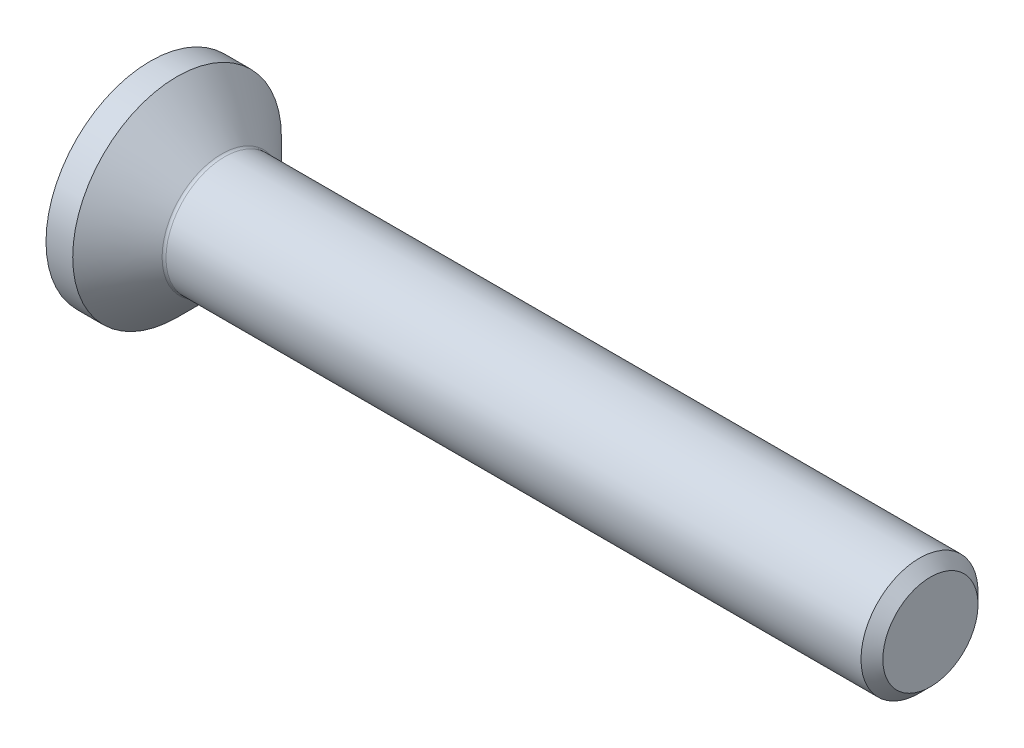
ISO-10303-21;
HEADER;
FILE_DESCRIPTION(('STEP AP214'),'2;1');
FILE_NAME('part.step','',(''),(''),'','','');
FILE_SCHEMA(('AUTOMOTIVE_DESIGN { 1 0 10303 214 1 1 1 1 }'));
ENDSEC;
DATA;
#1=APPLICATION_CONTEXT('core data for automotive mechanical design processes');
#2=APPLICATION_PROTOCOL_DEFINITION('international standard','automotive_design',2000,#1);
#3=PRODUCT_CONTEXT('',#1,'mechanical');
#4=PRODUCT('Part','Part','',(#3));
#5=PRODUCT_RELATED_PRODUCT_CATEGORY('part','',(#4));
#6=PRODUCT_DEFINITION_FORMATION('','',#4);
#7=PRODUCT_DEFINITION_CONTEXT('part definition',#1,'design');
#8=PRODUCT_DEFINITION('design','',#6,#7);
#9=PRODUCT_DEFINITION_SHAPE('','',#8);
#10=(LENGTH_UNIT() NAMED_UNIT(*) SI_UNIT(.MILLI.,.METRE.));
#11=(NAMED_UNIT(*) PLANE_ANGLE_UNIT() SI_UNIT($,.RADIAN.));
#12=(NAMED_UNIT(*) SI_UNIT($,.STERADIAN.) SOLID_ANGLE_UNIT());
#13=UNCERTAINTY_MEASURE_WITH_UNIT(LENGTH_MEASURE(1.E-05),#10,'distance_accuracy_value','');
#14=(GEOMETRIC_REPRESENTATION_CONTEXT(3) GLOBAL_UNCERTAINTY_ASSIGNED_CONTEXT((#13)) GLOBAL_UNIT_ASSIGNED_CONTEXT((#10,
#11,#12)) REPRESENTATION_CONTEXT('',''));
#15=CARTESIAN_POINT('',(0.,0.,0.));
#16=DIRECTION('',(0.,0.,1.));
#17=DIRECTION('',(1.,0.,0.));
#18=AXIS2_PLACEMENT_3D('',#15,#16,#17);
#19=CARTESIAN_POINT('',(0.,0.,0.));
#20=DIRECTION('',(-1.,0.,0.));
#21=DIRECTION('',(0.,0.,1.));
#22=AXIS2_PLACEMENT_3D('',#19,#20,#21);
#23=PLANE('',#22);
#24=CARTESIAN_POINT('',(0.,0.,0.));
#25=DIRECTION('',(-1.,0.,0.));
#26=DIRECTION('',(0.,0.,1.));
#27=AXIS2_PLACEMENT_3D('',#24,#25,#26);
#28=CIRCLE('',#27,2.675);
#29=CARTESIAN_POINT('',(0.,0.,2.675));
#30=VERTEX_POINT('',#29);
#31=EDGE_CURVE('E148',#30,#30,#28,.T.);
#32=ORIENTED_EDGE('',*,*,#31,.T.);
#33=EDGE_LOOP('',(#32));
#34=FACE_BOUND('',#33,.T.);
#35=DIRECTION('',(0.,-0.499999999999998,-0.86602540378444));
#36=VECTOR('',#35,1.);
#37=CARTESIAN_POINT('',(0.,-0.577350269189626,1.));
#38=LINE('',#37,#36);
#39=CARTESIAN_POINT('',(0.,-0.577350269189626,1.));
#40=VERTEX_POINT('',#39);
#41=CARTESIAN_POINT('',(0.,-1.15470053837925,0.));
#42=VERTEX_POINT('',#41);
#43=EDGE_CURVE('E114',#40,#42,#38,.T.);
#44=ORIENTED_EDGE('',*,*,#43,.T.);
#45=DIRECTION('',(0.,0.499999999999999,-0.866025403784439));
#46=VECTOR('',#45,1.);
#47=CARTESIAN_POINT('',(0.,-1.15470053837925,0.));
#48=LINE('',#47,#46);
#49=CARTESIAN_POINT('',(0.,-0.577350269189625,-1.));
#50=VERTEX_POINT('',#49);
#51=EDGE_CURVE('E45',#42,#50,#48,.T.);
#52=ORIENTED_EDGE('',*,*,#51,.T.);
#53=DIRECTION('',(0.,1.,0.));
#54=VECTOR('',#53,1.);
#55=CARTESIAN_POINT('',(0.,-0.577350269189625,-1.));
#56=LINE('',#55,#54);
#57=CARTESIAN_POINT('',(0.,0.577350269189626,-1.));
#58=VERTEX_POINT('',#57);
#59=EDGE_CURVE('E125',#50,#58,#56,.T.);
#60=ORIENTED_EDGE('',*,*,#59,.T.);
#61=DIRECTION('',(0.,0.5,0.866025403784439));
#62=VECTOR('',#61,1.);
#63=CARTESIAN_POINT('',(0.,0.577350269189626,-1.));
#64=LINE('',#63,#62);
#65=CARTESIAN_POINT('',(0.,1.15470053837925,0.));
#66=VERTEX_POINT('',#65);
#67=EDGE_CURVE('E249',#58,#66,#64,.T.);
#68=ORIENTED_EDGE('',*,*,#67,.T.);
#69=DIRECTION('',(0.,-0.499999999999999,0.866025403784439));
#70=VECTOR('',#69,1.);
#71=CARTESIAN_POINT('',(0.,1.15470053837925,0.));
#72=LINE('',#71,#70);
#73=CARTESIAN_POINT('',(0.,0.577350269189625,0.999999999999999));
#74=VERTEX_POINT('',#73);
#75=EDGE_CURVE('E252',#66,#74,#72,.T.);
#76=ORIENTED_EDGE('',*,*,#75,.T.);
#77=DIRECTION('',(0.,-1.,0.));
#78=VECTOR('',#77,1.);
#79=CARTESIAN_POINT('',(0.,0.577350269189625,0.999999999999999));
#80=LINE('',#79,#78);
#81=EDGE_CURVE('E255',#74,#40,#80,.T.);
#82=ORIENTED_EDGE('',*,*,#81,.T.);
#83=EDGE_LOOP('',(#44,#52,#60,#68,#76,#82));
#84=FACE_BOUND('',#83,.T.);
#85=ADVANCED_FACE('F30',(#34,#84),#23,.T.);
#86=CARTESIAN_POINT('',(0.,0.,0.));
#87=DIRECTION('',(-1.,0.,0.));
#88=DIRECTION('',(0.,0.,1.));
#89=AXIS2_PLACEMENT_3D('',#86,#87,#88);
#90=CYLINDRICAL_SURFACE('',#89,2.675);
#91=CARTESIAN_POINT('',(0.68500000000001,0.,0.));
#92=DIRECTION('',(-1.,0.,0.));
#93=DIRECTION('',(0.,0.,1.));
#94=AXIS2_PLACEMENT_3D('',#91,#92,#93);
#95=CIRCLE('',#94,2.675);
#96=CARTESIAN_POINT('',(0.68500000000001,0.,2.675));
#97=VERTEX_POINT('',#96);
#98=EDGE_CURVE('E145',#97,#97,#95,.T.);
#99=ORIENTED_EDGE('',*,*,#98,.T.);
#100=EDGE_LOOP('',(#99));
#101=FACE_BOUND('',#100,.T.);
#102=ORIENTED_EDGE('',*,*,#31,.F.);
#103=EDGE_LOOP('',(#102));
#104=FACE_BOUND('',#103,.T.);
#105=ADVANCED_FACE('F169',(#101,#104),#90,.T.);
#106=CARTESIAN_POINT('',(0.68500000000001,0.,0.));
#107=DIRECTION('',(-1.,0.,0.));
#108=DIRECTION('',(0.,0.,1.));
#109=AXIS2_PLACEMENT_3D('',#106,#107,#108);
#110=CONICAL_SURFACE('',#109,2.675,0.78539816339745);
#111=CARTESIAN_POINT('',(1.83071067811867,0.,0.));
#112=DIRECTION('',(-1.,0.,0.));
#113=DIRECTION('',(0.,0.,1.));
#114=AXIS2_PLACEMENT_3D('',#111,#112,#113);
#115=CIRCLE('',#114,1.52928932188134);
#116=CARTESIAN_POINT('',(1.83071067811867,0.,1.52928932188134));
#117=VERTEX_POINT('',#116);
#118=EDGE_CURVE('E38',#117,#117,#115,.T.);
#119=ORIENTED_EDGE('',*,*,#118,.T.);
#120=EDGE_LOOP('',(#119));
#121=FACE_BOUND('',#120,.T.);
#122=ORIENTED_EDGE('',*,*,#98,.F.);
#123=EDGE_LOOP('',(#122));
#124=FACE_BOUND('',#123,.T.);
#125=ADVANCED_FACE('F153',(#121,#124),#110,.T.);
#126=CARTESIAN_POINT('',(0.,0.,0.));
#127=DIRECTION('',(-1.,0.,0.));
#128=DIRECTION('',(0.,0.,1.));
#129=AXIS2_PLACEMENT_3D('',#126,#127,#128);
#130=CYLINDRICAL_SURFACE('',#129,1.49999999999999);
#131=CARTESIAN_POINT('',(1.90142135623732,0.,0.));
#132=DIRECTION('',(-1.,0.,0.));
#133=DIRECTION('',(0.,0.,1.));
#134=AXIS2_PLACEMENT_3D('',#131,#132,#133);
#135=CIRCLE('',#134,1.49999999999999);
#136=CARTESIAN_POINT('',(1.90142135623732,0.,1.49999999999999));
#137=VERTEX_POINT('',#136);
#138=EDGE_CURVE('E11',#137,#137,#135,.F.);
#139=ORIENTED_EDGE('',*,*,#138,.T.);
#140=EDGE_LOOP('',(#139));
#141=FACE_BOUND('',#140,.T.);
#142=CARTESIAN_POINT('',(19.7195,0.,0.));
#143=DIRECTION('',(-1.,0.,0.));
#144=DIRECTION('',(0.,0.,1.));
#145=AXIS2_PLACEMENT_3D('',#142,#143,#144);
#146=CIRCLE('',#145,1.49999999999998);
#147=CARTESIAN_POINT('',(19.7195,0.,1.49999999999998));
#148=VERTEX_POINT('',#147);
#149=EDGE_CURVE('E142',#148,#148,#146,.T.);
#150=ORIENTED_EDGE('',*,*,#149,.T.);
#151=EDGE_LOOP('',(#150));
#152=FACE_BOUND('',#151,.T.);
#153=ADVANCED_FACE('F180',(#141,#152),#130,.T.);
#154=CARTESIAN_POINT('',(20.,0.,0.));
#155=DIRECTION('',(-1.,0.,0.));
#156=DIRECTION('',(0.,0.,1.));
#157=AXIS2_PLACEMENT_3D('',#154,#155,#156);
#158=CONICAL_SURFACE('',#157,1.2195,0.785398163397386);
#159=ORIENTED_EDGE('',*,*,#149,.F.);
#160=EDGE_LOOP('',(#159));
#161=FACE_BOUND('',#160,.T.);
#162=CARTESIAN_POINT('',(20.,0.,0.));
#163=DIRECTION('',(-1.,0.,0.));
#164=DIRECTION('',(0.,0.,1.));
#165=AXIS2_PLACEMENT_3D('',#162,#163,#164);
#166=CIRCLE('',#165,1.2195);
#167=CARTESIAN_POINT('',(20.,0.,1.2195));
#168=VERTEX_POINT('',#167);
#169=EDGE_CURVE('E138',#168,#168,#166,.T.);
#170=ORIENTED_EDGE('',*,*,#169,.T.);
#171=EDGE_LOOP('',(#170));
#172=FACE_BOUND('',#171,.T.);
#173=ADVANCED_FACE('F164',(#161,#172),#158,.T.);
#174=CARTESIAN_POINT('',(20.,1.2195,0.));
#175=DIRECTION('',(1.,0.,0.));
#176=DIRECTION('',(0.,0.,-1.));
#177=AXIS2_PLACEMENT_3D('',#174,#175,#176);
#178=PLANE('',#177);
#179=ORIENTED_EDGE('',*,*,#169,.F.);
#180=EDGE_LOOP('',(#179));
#181=FACE_BOUND('',#180,.T.);
#182=ADVANCED_FACE('F157',(#181),#178,.T.);
#183=CARTESIAN_POINT('',(1.90142135623732,0.,0.));
#184=DIRECTION('',(-1.,0.,0.));
#185=DIRECTION('',(0.,0.,1.));
#186=AXIS2_PLACEMENT_3D('',#183,#184,#185);
#187=TOROIDAL_SURFACE('',#186,1.59999999999999,0.1);
#188=ORIENTED_EDGE('',*,*,#138,.F.);
#189=EDGE_LOOP('',(#188));
#190=FACE_BOUND('',#189,.T.);
#191=ORIENTED_EDGE('',*,*,#118,.F.);
#192=EDGE_LOOP('',(#191));
#193=FACE_BOUND('',#192,.T.);
#194=ADVANCED_FACE('F32',(#190,#193),#187,.F.);
#195=CARTESIAN_POINT('',(1.1,-1.15470053837925,0.));
#196=DIRECTION('',(0.,0.866025403784439,0.499999999999999));
#197=DIRECTION('',(0.,-0.499999999999999,0.866025403784439));
#198=AXIS2_PLACEMENT_3D('',#195,#196,#197);
#199=PLANE('',#198);
#200=ORIENTED_EDGE('',*,*,#51,.F.);
#201=DIRECTION('',(-1.,0.,0.));
#202=VECTOR('',#201,1.);
#203=CARTESIAN_POINT('',(1.1,-1.15470053837925,0.));
#204=LINE('',#203,#202);
#205=CARTESIAN_POINT('',(1.1,-1.15470053837925,0.));
#206=VERTEX_POINT('',#205);
#207=EDGE_CURVE('E246',#206,#42,#204,.T.);
#208=ORIENTED_EDGE('',*,*,#207,.F.);
#209=DIRECTION('',(0.,0.499999999999999,-0.866025403784439));
#210=VECTOR('',#209,1.);
#211=CARTESIAN_POINT('',(1.1,-1.15470053837925,0.));
#212=LINE('',#211,#210);
#213=CARTESIAN_POINT('',(1.1,-0.866025403784438,-0.499999999999998));
#214=VERTEX_POINT('',#213);
#215=EDGE_CURVE('E110',#206,#214,#212,.T.);
#216=ORIENTED_EDGE('',*,*,#215,.T.);
#217=CARTESIAN_POINT('',(1.1,-0.577350269189625,-1.));
#218=VERTEX_POINT('',#217);
#219=EDGE_CURVE('E106',#214,#218,#212,.T.);
#220=ORIENTED_EDGE('',*,*,#219,.T.);
#221=DIRECTION('',(-1.,0.,0.));
#222=VECTOR('',#221,1.);
#223=CARTESIAN_POINT('',(1.1,-0.577350269189625,-1.));
#224=LINE('',#223,#222);
#225=EDGE_CURVE('E108',#218,#50,#224,.T.);
#226=ORIENTED_EDGE('',*,*,#225,.T.);
#227=EDGE_LOOP('',(#200,#208,#216,#220,#226));
#228=FACE_BOUND('',#227,.T.);
#229=ADVANCED_FACE('F107',(#228),#199,.T.);
#230=CARTESIAN_POINT('',(1.1,-0.577350269189625,-1.));
#231=DIRECTION('',(0.,0.,1.));
#232=DIRECTION('',(1.,0.,0.));
#233=AXIS2_PLACEMENT_3D('',#230,#231,#232);
#234=PLANE('',#233);
#235=ORIENTED_EDGE('',*,*,#59,.F.);
#236=ORIENTED_EDGE('',*,*,#225,.F.);
#237=DIRECTION('',(0.,1.,0.));
#238=VECTOR('',#237,1.);
#239=CARTESIAN_POINT('',(1.1,-0.577350269189625,-1.));
#240=LINE('',#239,#238);
#241=CARTESIAN_POINT('',(1.1,0.,-1.));
#242=VERTEX_POINT('',#241);
#243=EDGE_CURVE('E53',#218,#242,#240,.T.);
#244=ORIENTED_EDGE('',*,*,#243,.T.);
#245=CARTESIAN_POINT('',(1.1,0.577350269189626,-1.));
#246=VERTEX_POINT('',#245);
#247=EDGE_CURVE('E120',#242,#246,#240,.T.);
#248=ORIENTED_EDGE('',*,*,#247,.T.);
#249=DIRECTION('',(-1.,0.,0.));
#250=VECTOR('',#249,1.);
#251=CARTESIAN_POINT('',(1.1,0.577350269189626,-1.));
#252=LINE('',#251,#250);
#253=EDGE_CURVE('E127',#246,#58,#252,.T.);
#254=ORIENTED_EDGE('',*,*,#253,.T.);
#255=EDGE_LOOP('',(#235,#236,#244,#248,#254));
#256=FACE_BOUND('',#255,.T.);
#257=ADVANCED_FACE('F122',(#256),#234,.T.);
#258=CARTESIAN_POINT('',(1.1,0.577350269189626,-1.));
#259=DIRECTION('',(0.,-0.866025403784438,0.5));
#260=DIRECTION('',(0.,-0.5,-0.866025403784439));
#261=AXIS2_PLACEMENT_3D('',#258,#259,#260);
#262=PLANE('',#261);
#263=ORIENTED_EDGE('',*,*,#67,.F.);
#264=ORIENTED_EDGE('',*,*,#253,.F.);
#265=DIRECTION('',(0.,0.5,0.866025403784439));
#266=VECTOR('',#265,1.);
#267=CARTESIAN_POINT('',(1.1,0.577350269189626,-1.));
#268=LINE('',#267,#266);
#269=CARTESIAN_POINT('',(1.1,0.866025403784439,-0.5));
#270=VERTEX_POINT('',#269);
#271=EDGE_CURVE('E227',#246,#270,#268,.T.);
#272=ORIENTED_EDGE('',*,*,#271,.T.);
#273=CARTESIAN_POINT('',(1.1,1.15470053837925,0.));
#274=VERTEX_POINT('',#273);
#275=EDGE_CURVE('E119',#270,#274,#268,.T.);
#276=ORIENTED_EDGE('',*,*,#275,.T.);
#277=DIRECTION('',(-1.,0.,0.));
#278=VECTOR('',#277,1.);
#279=CARTESIAN_POINT('',(1.1,1.15470053837925,0.));
#280=LINE('',#279,#278);
#281=EDGE_CURVE('E133',#274,#66,#280,.T.);
#282=ORIENTED_EDGE('',*,*,#281,.T.);
#283=EDGE_LOOP('',(#263,#264,#272,#276,#282));
#284=FACE_BOUND('',#283,.T.);
#285=ADVANCED_FACE('F194',(#284),#262,.T.);
#286=CARTESIAN_POINT('',(1.1,1.15470053837925,0.));
#287=DIRECTION('',(0.,-0.866025403784439,-0.499999999999999));
#288=DIRECTION('',(0.,0.499999999999999,-0.866025403784439));
#289=AXIS2_PLACEMENT_3D('',#286,#287,#288);
#290=PLANE('',#289);
#291=ORIENTED_EDGE('',*,*,#75,.F.);
#292=ORIENTED_EDGE('',*,*,#281,.F.);
#293=DIRECTION('',(0.,-0.499999999999999,0.866025403784439));
#294=VECTOR('',#293,1.);
#295=CARTESIAN_POINT('',(1.1,1.15470053837925,0.));
#296=LINE('',#295,#294);
#297=CARTESIAN_POINT('',(1.1,0.866025403784438,0.499999999999999));
#298=VERTEX_POINT('',#297);
#299=EDGE_CURVE('E234',#274,#298,#296,.T.);
#300=ORIENTED_EDGE('',*,*,#299,.T.);
#301=CARTESIAN_POINT('',(1.1,0.577350269189625,0.999999999999999));
#302=VERTEX_POINT('',#301);
#303=EDGE_CURVE('E232',#298,#302,#296,.T.);
#304=ORIENTED_EDGE('',*,*,#303,.T.);
#305=DIRECTION('',(-1.,0.,0.));
#306=VECTOR('',#305,1.);
#307=CARTESIAN_POINT('',(1.1,0.577350269189625,0.999999999999999));
#308=LINE('',#307,#306);
#309=EDGE_CURVE('E264',#302,#74,#308,.T.);
#310=ORIENTED_EDGE('',*,*,#309,.T.);
#311=EDGE_LOOP('',(#291,#292,#300,#304,#310));
#312=FACE_BOUND('',#311,.T.);
#313=ADVANCED_FACE('F197',(#312),#290,.T.);
#314=CARTESIAN_POINT('',(1.1,0.577350269189625,0.999999999999999));
#315=DIRECTION('',(0.,0.,-1.));
#316=DIRECTION('',(0.,1.,0.));
#317=AXIS2_PLACEMENT_3D('',#314,#315,#316);
#318=PLANE('',#317);
#319=ORIENTED_EDGE('',*,*,#81,.F.);
#320=ORIENTED_EDGE('',*,*,#309,.F.);
#321=DIRECTION('',(0.,-1.,0.));
#322=VECTOR('',#321,1.);
#323=CARTESIAN_POINT('',(1.1,0.577350269189625,0.999999999999999));
#324=LINE('',#323,#322);
#325=CARTESIAN_POINT('',(1.1,0.,1.));
#326=VERTEX_POINT('',#325);
#327=EDGE_CURVE('E239',#302,#326,#324,.T.);
#328=ORIENTED_EDGE('',*,*,#327,.T.);
#329=CARTESIAN_POINT('',(1.1,-0.577350269189626,1.));
#330=VERTEX_POINT('',#329);
#331=EDGE_CURVE('E238',#326,#330,#324,.T.);
#332=ORIENTED_EDGE('',*,*,#331,.T.);
#333=DIRECTION('',(-1.,0.,0.));
#334=VECTOR('',#333,1.);
#335=CARTESIAN_POINT('',(1.1,-0.577350269189626,1.));
#336=LINE('',#335,#334);
#337=EDGE_CURVE('E261',#330,#40,#336,.T.);
#338=ORIENTED_EDGE('',*,*,#337,.T.);
#339=EDGE_LOOP('',(#319,#320,#328,#332,#338));
#340=FACE_BOUND('',#339,.T.);
#341=ADVANCED_FACE('F201',(#340),#318,.T.);
#342=CARTESIAN_POINT('',(1.1,-0.577350269189626,1.));
#343=DIRECTION('',(0.,0.86602540378444,-0.499999999999998));
#344=DIRECTION('',(0.,0.499999999999998,0.86602540378444));
#345=AXIS2_PLACEMENT_3D('',#342,#343,#344);
#346=PLANE('',#345);
#347=ORIENTED_EDGE('',*,*,#43,.F.);
#348=ORIENTED_EDGE('',*,*,#337,.F.);
#349=DIRECTION('',(0.,-0.499999999999998,-0.86602540378444));
#350=VECTOR('',#349,1.);
#351=CARTESIAN_POINT('',(1.1,-0.577350269189626,1.));
#352=LINE('',#351,#350);
#353=CARTESIAN_POINT('',(1.1,-0.866025403784439,0.499999999999997));
#354=VERTEX_POINT('',#353);
#355=EDGE_CURVE('E243',#330,#354,#352,.T.);
#356=ORIENTED_EDGE('',*,*,#355,.T.);
#357=EDGE_CURVE('E242',#354,#206,#352,.T.);
#358=ORIENTED_EDGE('',*,*,#357,.T.);
#359=ORIENTED_EDGE('',*,*,#207,.T.);
#360=EDGE_LOOP('',(#347,#348,#356,#358,#359));
#361=FACE_BOUND('',#360,.T.);
#362=ADVANCED_FACE('F205',(#361),#346,.T.);
#363=CARTESIAN_POINT('',(1.1,-0.577350269189626,-1.));
#364=DIRECTION('',(1.,0.,0.));
#365=DIRECTION('',(0.,0.,-1.));
#366=AXIS2_PLACEMENT_3D('',#363,#364,#365);
#367=PLANE('',#366);
#368=ORIENTED_EDGE('',*,*,#243,.F.);
#369=ORIENTED_EDGE('',*,*,#219,.F.);
#370=CARTESIAN_POINT('',(1.1,0.,0.));
#371=DIRECTION('',(-1.,0.,0.));
#372=DIRECTION('',(0.,0.,1.));
#373=AXIS2_PLACEMENT_3D('',#370,#371,#372);
#374=CIRCLE('',#373,1.);
#375=EDGE_CURVE('E117',#242,#214,#374,.T.);
#376=ORIENTED_EDGE('',*,*,#375,.F.);
#377=EDGE_LOOP('',(#368,#369,#376));
#378=FACE_BOUND('',#377,.T.);
#379=ADVANCED_FACE('F116',(#378),#367,.F.);
#380=ORIENTED_EDGE('',*,*,#215,.F.);
#381=ORIENTED_EDGE('',*,*,#357,.F.);
#382=EDGE_CURVE('E130',#214,#354,#374,.T.);
#383=ORIENTED_EDGE('',*,*,#382,.F.);
#384=EDGE_LOOP('',(#380,#381,#383));
#385=FACE_BOUND('',#384,.T.);
#386=ADVANCED_FACE('F211',(#385),#367,.F.);
#387=ORIENTED_EDGE('',*,*,#355,.F.);
#388=ORIENTED_EDGE('',*,*,#331,.F.);
#389=EDGE_CURVE('E126',#354,#326,#374,.T.);
#390=ORIENTED_EDGE('',*,*,#389,.F.);
#391=EDGE_LOOP('',(#387,#388,#390));
#392=FACE_BOUND('',#391,.T.);
#393=ADVANCED_FACE('F215',(#392),#367,.F.);
#394=ORIENTED_EDGE('',*,*,#327,.F.);
#395=ORIENTED_EDGE('',*,*,#303,.F.);
#396=EDGE_CURVE('E132',#326,#298,#374,.T.);
#397=ORIENTED_EDGE('',*,*,#396,.F.);
#398=EDGE_LOOP('',(#394,#395,#397));
#399=FACE_BOUND('',#398,.T.);
#400=ADVANCED_FACE('F223',(#399),#367,.F.);
#401=ORIENTED_EDGE('',*,*,#299,.F.);
#402=ORIENTED_EDGE('',*,*,#275,.F.);
#403=EDGE_CURVE('E139',#298,#270,#374,.T.);
#404=ORIENTED_EDGE('',*,*,#403,.F.);
#405=EDGE_LOOP('',(#401,#402,#404));
#406=FACE_BOUND('',#405,.T.);
#407=ADVANCED_FACE('F218',(#406),#367,.F.);
#408=ORIENTED_EDGE('',*,*,#271,.F.);
#409=ORIENTED_EDGE('',*,*,#247,.F.);
#410=EDGE_CURVE('E228',#270,#242,#374,.T.);
#411=ORIENTED_EDGE('',*,*,#410,.F.);
#412=EDGE_LOOP('',(#408,#409,#411));
#413=FACE_BOUND('',#412,.T.);
#414=ADVANCED_FACE('F189',(#413),#367,.F.);
#415=CARTESIAN_POINT('',(1.1,0.,0.));
#416=DIRECTION('',(-1.,0.,0.));
#417=DIRECTION('',(0.,0.,1.));
#418=AXIS2_PLACEMENT_3D('',#415,#416,#417);
#419=CONICAL_SURFACE('',#418,1.,1.04719755119659);
#420=CARTESIAN_POINT('',(1.67735026918963,0.,0.));
#421=VERTEX_POINT('',#420);
#422=VERTEX_LOOP('',#421);
#423=FACE_BOUND('',#422,.T.);
#424=ORIENTED_EDGE('',*,*,#396,.T.);
#425=ORIENTED_EDGE('',*,*,#403,.T.);
#426=ORIENTED_EDGE('',*,*,#410,.T.);
#427=ORIENTED_EDGE('',*,*,#375,.T.);
#428=ORIENTED_EDGE('',*,*,#382,.T.);
#429=ORIENTED_EDGE('',*,*,#389,.T.);
#430=EDGE_LOOP('',(#424,#425,#426,#427,#428,#429));
#431=FACE_BOUND('',#430,.T.);
#432=ADVANCED_FACE('F187',(#423,#431),#419,.F.);
#433=CLOSED_SHELL('',(#85,#105,#125,#153,#173,#182,#194,#229,#257,#285,#313,#341,#362,#379,#386,
#393,#400,#407,#414,#432));
#434=MANIFOLD_SOLID_BREP('B2',#433);
#435=ADVANCED_BREP_SHAPE_REPRESENTATION('',(#18,#434),#14);
#436=SHAPE_DEFINITION_REPRESENTATION(#9,#435);
ENDSEC;
END-ISO-10303-21;
